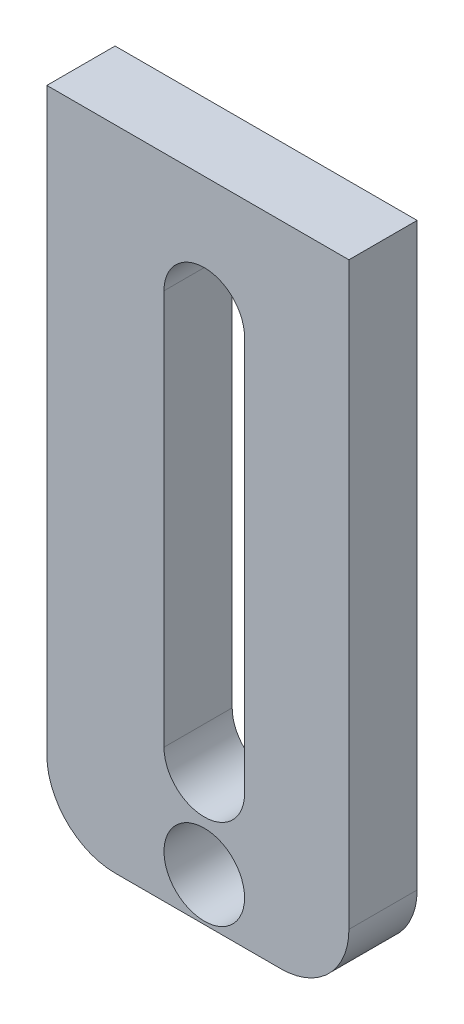
ISO-10303-21;
HEADER;
FILE_DESCRIPTION(('STEP AP214'),'2;1');
FILE_NAME('part.step','',(''),(''),'','','');
FILE_SCHEMA(('AUTOMOTIVE_DESIGN { 1 0 10303 214 1 1 1 1 }'));
ENDSEC;
DATA;
#1=APPLICATION_CONTEXT('core data for automotive mechanical design processes');
#2=APPLICATION_PROTOCOL_DEFINITION('international standard','automotive_design',2000,#1);
#3=PRODUCT_CONTEXT('',#1,'mechanical');
#4=PRODUCT('Part','Part','',(#3));
#5=PRODUCT_RELATED_PRODUCT_CATEGORY('part','',(#4));
#6=PRODUCT_DEFINITION_FORMATION('','',#4);
#7=PRODUCT_DEFINITION_CONTEXT('part definition',#1,'design');
#8=PRODUCT_DEFINITION('design','',#6,#7);
#9=PRODUCT_DEFINITION_SHAPE('','',#8);
#10=(LENGTH_UNIT() NAMED_UNIT(*) SI_UNIT(.MILLI.,.METRE.));
#11=(NAMED_UNIT(*) PLANE_ANGLE_UNIT() SI_UNIT($,.RADIAN.));
#12=(NAMED_UNIT(*) SI_UNIT($,.STERADIAN.) SOLID_ANGLE_UNIT());
#13=UNCERTAINTY_MEASURE_WITH_UNIT(LENGTH_MEASURE(1.E-05),#10,'distance_accuracy_value','');
#14=(GEOMETRIC_REPRESENTATION_CONTEXT(3) GLOBAL_UNCERTAINTY_ASSIGNED_CONTEXT((#13)) GLOBAL_UNIT_ASSIGNED_CONTEXT((#10,
#11,#12)) REPRESENTATION_CONTEXT('',''));
#15=CARTESIAN_POINT('',(0.,0.,0.));
#16=DIRECTION('',(0.,0.,1.));
#17=DIRECTION('',(1.,0.,0.));
#18=AXIS2_PLACEMENT_3D('',#15,#16,#17);
#19=CARTESIAN_POINT('',(-143.509134839057,40.8788345090407,5.08));
#20=DIRECTION('',(0.,0.,-1.));
#21=DIRECTION('',(-1.,0.,0.));
#22=AXIS2_PLACEMENT_3D('',#19,#20,#21);
#23=CYLINDRICAL_SURFACE('',#22,3.);
#24=CARTESIAN_POINT('',(-143.509134839057,40.8788345090407,0.));
#25=DIRECTION('',(0.,0.,1.));
#26=DIRECTION('',(1.,0.,0.));
#27=AXIS2_PLACEMENT_3D('',#24,#25,#26);
#28=CIRCLE('',#27,3.);
#29=CARTESIAN_POINT('',(-146.509134839057,40.8788345090407,0.));
#30=VERTEX_POINT('',#29);
#31=CARTESIAN_POINT('',(-140.509134839057,40.8788345090407,0.));
#32=VERTEX_POINT('',#31);
#33=EDGE_CURVE('E165',#30,#32,#28,.T.);
#34=ORIENTED_EDGE('',*,*,#33,.F.);
#35=DIRECTION('',(0.,0.,-1.));
#36=VECTOR('',#35,1.);
#37=CARTESIAN_POINT('',(-146.509134839057,40.8788345090407,5.08));
#38=LINE('',#37,#36);
#39=CARTESIAN_POINT('',(-146.509134839057,40.8788345090407,5.08));
#40=VERTEX_POINT('',#39);
#41=EDGE_CURVE('E11',#40,#30,#38,.T.);
#42=ORIENTED_EDGE('',*,*,#41,.F.);
#43=CARTESIAN_POINT('',(-143.509134839057,40.8788345090407,5.08));
#44=DIRECTION('',(0.,0.,1.));
#45=DIRECTION('',(1.,0.,0.));
#46=AXIS2_PLACEMENT_3D('',#43,#44,#45);
#47=CIRCLE('',#46,3.);
#48=CARTESIAN_POINT('',(-140.509134839057,40.8788345090407,5.08));
#49=VERTEX_POINT('',#48);
#50=EDGE_CURVE('E136',#40,#49,#47,.T.);
#51=ORIENTED_EDGE('',*,*,#50,.T.);
#52=DIRECTION('',(0.,0.,-1.));
#53=VECTOR('',#52,1.);
#54=CARTESIAN_POINT('',(-140.509134839057,40.8788345090407,5.08));
#55=LINE('',#54,#53);
#56=EDGE_CURVE('E94',#49,#32,#55,.T.);
#57=ORIENTED_EDGE('',*,*,#56,.T.);
#58=EDGE_LOOP('',(#34,#42,#51,#57));
#59=FACE_BOUND('',#58,.T.);
#60=ADVANCED_FACE('F35',(#59),#23,.F.);
#61=CARTESIAN_POINT('',(-146.509134839057,0.,5.08));
#62=DIRECTION('',(1.,0.,0.));
#63=DIRECTION('',(0.,0.,-1.));
#64=AXIS2_PLACEMENT_3D('',#61,#62,#63);
#65=PLANE('',#64);
#66=DIRECTION('',(0.,-1.,0.));
#67=VECTOR('',#66,1.);
#68=CARTESIAN_POINT('',(-146.509134839057,0.,0.));
#69=LINE('',#68,#67);
#70=CARTESIAN_POINT('',(-146.509134839057,70.311824491359,0.));
#71=VERTEX_POINT('',#70);
#72=EDGE_CURVE('E127',#71,#30,#69,.T.);
#73=ORIENTED_EDGE('',*,*,#72,.F.);
#74=DIRECTION('',(0.,0.,-1.));
#75=VECTOR('',#74,1.);
#76=CARTESIAN_POINT('',(-146.509134839057,70.311824491359,5.08));
#77=LINE('',#76,#75);
#78=CARTESIAN_POINT('',(-146.509134839057,70.311824491359,5.08));
#79=VERTEX_POINT('',#78);
#80=EDGE_CURVE('E45',#79,#71,#77,.T.);
#81=ORIENTED_EDGE('',*,*,#80,.F.);
#82=DIRECTION('',(0.,-1.,0.));
#83=VECTOR('',#82,1.);
#84=CARTESIAN_POINT('',(-146.509134839057,0.,5.08));
#85=LINE('',#84,#83);
#86=EDGE_CURVE('E125',#79,#40,#85,.T.);
#87=ORIENTED_EDGE('',*,*,#86,.T.);
#88=ORIENTED_EDGE('',*,*,#41,.T.);
#89=EDGE_LOOP('',(#73,#81,#87,#88));
#90=FACE_BOUND('',#89,.T.);
#91=ADVANCED_FACE('F124',(#90),#65,.T.);
#92=CARTESIAN_POINT('',(-143.509134839057,70.311824491359,5.08));
#93=DIRECTION('',(0.,0.,-1.));
#94=DIRECTION('',(-1.,0.,0.));
#95=AXIS2_PLACEMENT_3D('',#92,#93,#94);
#96=CYLINDRICAL_SURFACE('',#95,3.);
#97=CARTESIAN_POINT('',(-143.509134839057,70.311824491359,0.));
#98=DIRECTION('',(0.,0.,1.));
#99=DIRECTION('',(1.,0.,0.));
#100=AXIS2_PLACEMENT_3D('',#97,#98,#99);
#101=CIRCLE('',#100,3.);
#102=CARTESIAN_POINT('',(-140.509134839057,70.311824491359,0.));
#103=VERTEX_POINT('',#102);
#104=EDGE_CURVE('E169',#103,#71,#101,.T.);
#105=ORIENTED_EDGE('',*,*,#104,.F.);
#106=DIRECTION('',(0.,0.,-1.));
#107=VECTOR('',#106,1.);
#108=CARTESIAN_POINT('',(-140.509134839057,70.311824491359,5.08));
#109=LINE('',#108,#107);
#110=CARTESIAN_POINT('',(-140.509134839057,70.311824491359,5.08));
#111=VERTEX_POINT('',#110);
#112=EDGE_CURVE('E87',#111,#103,#109,.T.);
#113=ORIENTED_EDGE('',*,*,#112,.F.);
#114=CARTESIAN_POINT('',(-143.509134839057,70.311824491359,5.08));
#115=DIRECTION('',(0.,0.,1.));
#116=DIRECTION('',(1.,0.,0.));
#117=AXIS2_PLACEMENT_3D('',#114,#115,#116);
#118=CIRCLE('',#117,3.);
#119=EDGE_CURVE('E135',#111,#79,#118,.T.);
#120=ORIENTED_EDGE('',*,*,#119,.T.);
#121=ORIENTED_EDGE('',*,*,#80,.T.);
#122=EDGE_LOOP('',(#105,#113,#120,#121));
#123=FACE_BOUND('',#122,.T.);
#124=ADVANCED_FACE('F138',(#123),#96,.F.);
#125=CARTESIAN_POINT('',(-150.150857377842,36.0192520602848,5.08));
#126=DIRECTION('',(0.,0.,-1.));
#127=DIRECTION('',(-1.,0.,0.));
#128=AXIS2_PLACEMENT_3D('',#125,#126,#127);
#129=CYLINDRICAL_SURFACE('',#128,5.08);
#130=CARTESIAN_POINT('',(-150.150857377842,36.0192520602848,0.));
#131=DIRECTION('',(0.,0.,1.));
#132=DIRECTION('',(1.,0.,0.));
#133=AXIS2_PLACEMENT_3D('',#130,#131,#132);
#134=CIRCLE('',#133,5.08);
#135=CARTESIAN_POINT('',(-150.150857377842,30.9392520602848,0.));
#136=VERTEX_POINT('',#135);
#137=CARTESIAN_POINT('',(-155.230857377842,36.0192520602848,0.));
#138=VERTEX_POINT('',#137);
#139=EDGE_CURVE('E147',#136,#138,#134,.F.);
#140=ORIENTED_EDGE('',*,*,#139,.F.);
#141=DIRECTION('',(0.,0.,-1.));
#142=VECTOR('',#141,1.);
#143=CARTESIAN_POINT('',(-150.150857377842,30.9392520602848,5.08));
#144=LINE('',#143,#142);
#145=CARTESIAN_POINT('',(-150.150857377842,30.9392520602848,5.08));
#146=VERTEX_POINT('',#145);
#147=EDGE_CURVE('E39',#146,#136,#144,.T.);
#148=ORIENTED_EDGE('',*,*,#147,.F.);
#149=CARTESIAN_POINT('',(-150.150857377842,36.0192520602848,5.08));
#150=DIRECTION('',(0.,0.,1.));
#151=DIRECTION('',(1.,0.,0.));
#152=AXIS2_PLACEMENT_3D('',#149,#150,#151);
#153=CIRCLE('',#152,5.08);
#154=CARTESIAN_POINT('',(-155.230857377842,36.0192520602848,5.08));
#155=VERTEX_POINT('',#154);
#156=EDGE_CURVE('E176',#146,#155,#153,.F.);
#157=ORIENTED_EDGE('',*,*,#156,.T.);
#158=DIRECTION('',(0.,0.,-1.));
#159=VECTOR('',#158,1.);
#160=CARTESIAN_POINT('',(-155.230857377842,36.0192520602848,5.08));
#161=LINE('',#160,#159);
#162=EDGE_CURVE('E146',#155,#138,#161,.T.);
#163=ORIENTED_EDGE('',*,*,#162,.T.);
#164=EDGE_LOOP('',(#140,#148,#157,#163));
#165=FACE_BOUND('',#164,.T.);
#166=ADVANCED_FACE('F37',(#165),#129,.T.);
#167=CARTESIAN_POINT('',(0.,30.9392520602848,5.08));
#168=DIRECTION('',(0.,-1.,0.));
#169=DIRECTION('',(0.,0.,-1.));
#170=AXIS2_PLACEMENT_3D('',#167,#168,#169);
#171=PLANE('',#170);
#172=DIRECTION('',(-1.,0.,0.));
#173=VECTOR('',#172,1.);
#174=CARTESIAN_POINT('',(0.,30.9392520602848,0.));
#175=LINE('',#174,#173);
#176=CARTESIAN_POINT('',(-137.817233388771,30.9392520602848,0.));
#177=VERTEX_POINT('',#176);
#178=EDGE_CURVE('E150',#177,#136,#175,.T.);
#179=ORIENTED_EDGE('',*,*,#178,.F.);
#180=DIRECTION('',(0.,0.,-1.));
#181=VECTOR('',#180,1.);
#182=CARTESIAN_POINT('',(-137.817233388771,30.9392520602848,5.08));
#183=LINE('',#182,#181);
#184=CARTESIAN_POINT('',(-137.817233388771,30.9392520602848,5.08));
#185=VERTEX_POINT('',#184);
#186=EDGE_CURVE('E185',#185,#177,#183,.T.);
#187=ORIENTED_EDGE('',*,*,#186,.F.);
#188=DIRECTION('',(-1.,0.,0.));
#189=VECTOR('',#188,1.);
#190=CARTESIAN_POINT('',(0.,30.9392520602848,5.08));
#191=LINE('',#190,#189);
#192=EDGE_CURVE('E194',#185,#146,#191,.T.);
#193=ORIENTED_EDGE('',*,*,#192,.T.);
#194=ORIENTED_EDGE('',*,*,#147,.T.);
#195=EDGE_LOOP('',(#179,#187,#193,#194));
#196=FACE_BOUND('',#195,.T.);
#197=ADVANCED_FACE('F192',(#196),#171,.T.);
#198=CARTESIAN_POINT('',(-137.817233388771,36.0192520602848,5.08));
#199=DIRECTION('',(0.,0.,-1.));
#200=DIRECTION('',(-1.,0.,0.));
#201=AXIS2_PLACEMENT_3D('',#198,#199,#200);
#202=CYLINDRICAL_SURFACE('',#201,5.08);
#203=CARTESIAN_POINT('',(-137.817233388771,36.0192520602848,0.));
#204=DIRECTION('',(0.,0.,1.));
#205=DIRECTION('',(1.,0.,0.));
#206=AXIS2_PLACEMENT_3D('',#203,#204,#205);
#207=CIRCLE('',#206,5.08);
#208=CARTESIAN_POINT('',(-132.737233388771,36.0192520602848,0.));
#209=VERTEX_POINT('',#208);
#210=EDGE_CURVE('E153',#209,#177,#207,.F.);
#211=ORIENTED_EDGE('',*,*,#210,.F.);
#212=DIRECTION('',(0.,0.,-1.));
#213=VECTOR('',#212,1.);
#214=CARTESIAN_POINT('',(-132.737233388771,36.0192520602848,5.08));
#215=LINE('',#214,#213);
#216=CARTESIAN_POINT('',(-132.737233388771,36.0192520602848,5.08));
#217=VERTEX_POINT('',#216);
#218=EDGE_CURVE('E184',#217,#209,#215,.T.);
#219=ORIENTED_EDGE('',*,*,#218,.F.);
#220=CARTESIAN_POINT('',(-137.817233388771,36.0192520602848,5.08));
#221=DIRECTION('',(0.,0.,1.));
#222=DIRECTION('',(1.,0.,0.));
#223=AXIS2_PLACEMENT_3D('',#220,#221,#222);
#224=CIRCLE('',#223,5.08);
#225=EDGE_CURVE('E202',#217,#185,#224,.F.);
#226=ORIENTED_EDGE('',*,*,#225,.T.);
#227=ORIENTED_EDGE('',*,*,#186,.T.);
#228=EDGE_LOOP('',(#211,#219,#226,#227));
#229=FACE_BOUND('',#228,.T.);
#230=ADVANCED_FACE('F200',(#229),#202,.T.);
#231=CARTESIAN_POINT('',(-132.737233388771,0.,5.08));
#232=DIRECTION('',(1.,0.,0.));
#233=DIRECTION('',(0.,0.,-1.));
#234=AXIS2_PLACEMENT_3D('',#231,#232,#233);
#235=PLANE('',#234);
#236=DIRECTION('',(0.,-1.,0.));
#237=VECTOR('',#236,1.);
#238=CARTESIAN_POINT('',(-132.737233388771,0.,0.));
#239=LINE('',#238,#237);
#240=CARTESIAN_POINT('',(-132.737233388771,79.1992520602848,0.));
#241=VERTEX_POINT('',#240);
#242=EDGE_CURVE('E156',#241,#209,#239,.T.);
#243=ORIENTED_EDGE('',*,*,#242,.F.);
#244=DIRECTION('',(0.,0.,-1.));
#245=VECTOR('',#244,1.);
#246=CARTESIAN_POINT('',(-132.737233388771,79.1992520602848,5.08));
#247=LINE('',#246,#245);
#248=CARTESIAN_POINT('',(-132.737233388771,79.1992520602848,5.08));
#249=VERTEX_POINT('',#248);
#250=EDGE_CURVE('E182',#249,#241,#247,.T.);
#251=ORIENTED_EDGE('',*,*,#250,.F.);
#252=DIRECTION('',(0.,-1.,0.));
#253=VECTOR('',#252,1.);
#254=CARTESIAN_POINT('',(-132.737233388771,0.,5.08));
#255=LINE('',#254,#253);
#256=EDGE_CURVE('E208',#249,#217,#255,.T.);
#257=ORIENTED_EDGE('',*,*,#256,.T.);
#258=ORIENTED_EDGE('',*,*,#218,.T.);
#259=EDGE_LOOP('',(#243,#251,#257,#258));
#260=FACE_BOUND('',#259,.T.);
#261=ADVANCED_FACE('F211',(#260),#235,.T.);
#262=CARTESIAN_POINT('',(0.,79.1992520602848,5.08));
#263=DIRECTION('',(0.,1.,0.));
#264=DIRECTION('',(0.,0.,1.));
#265=AXIS2_PLACEMENT_3D('',#262,#263,#264);
#266=PLANE('',#265);
#267=DIRECTION('',(1.,0.,0.));
#268=VECTOR('',#267,1.);
#269=CARTESIAN_POINT('',(0.,79.1992520602848,0.));
#270=LINE('',#269,#268);
#271=CARTESIAN_POINT('',(-155.230857377842,79.1992520602848,0.));
#272=VERTEX_POINT('',#271);
#273=EDGE_CURVE('E159',#272,#241,#270,.T.);
#274=ORIENTED_EDGE('',*,*,#273,.F.);
#275=DIRECTION('',(0.,0.,-1.));
#276=VECTOR('',#275,1.);
#277=CARTESIAN_POINT('',(-155.230857377842,79.1992520602848,5.08));
#278=LINE('',#277,#276);
#279=CARTESIAN_POINT('',(-155.230857377842,79.1992520602848,5.08));
#280=VERTEX_POINT('',#279);
#281=EDGE_CURVE('E180',#280,#272,#278,.T.);
#282=ORIENTED_EDGE('',*,*,#281,.F.);
#283=DIRECTION('',(1.,0.,0.));
#284=VECTOR('',#283,1.);
#285=CARTESIAN_POINT('',(0.,79.1992520602848,5.08));
#286=LINE('',#285,#284);
#287=EDGE_CURVE('E212',#280,#249,#286,.T.);
#288=ORIENTED_EDGE('',*,*,#287,.T.);
#289=ORIENTED_EDGE('',*,*,#250,.T.);
#290=EDGE_LOOP('',(#274,#282,#288,#289));
#291=FACE_BOUND('',#290,.T.);
#292=ADVANCED_FACE('F223',(#291),#266,.T.);
#293=CARTESIAN_POINT('',(-140.509134839057,0.,5.08));
#294=DIRECTION('',(1.,0.,0.));
#295=DIRECTION('',(0.,0.,-1.));
#296=AXIS2_PLACEMENT_3D('',#293,#294,#295);
#297=PLANE('',#296);
#298=DIRECTION('',(0.,-1.,0.));
#299=VECTOR('',#298,1.);
#300=CARTESIAN_POINT('',(-140.509134839057,0.,0.));
#301=LINE('',#300,#299);
#302=EDGE_CURVE('E171',#103,#32,#301,.T.);
#303=ORIENTED_EDGE('',*,*,#302,.T.);
#304=ORIENTED_EDGE('',*,*,#56,.F.);
#305=DIRECTION('',(0.,-1.,0.));
#306=VECTOR('',#305,1.);
#307=CARTESIAN_POINT('',(-140.509134839057,0.,5.08));
#308=LINE('',#307,#306);
#309=EDGE_CURVE('E54',#111,#49,#308,.T.);
#310=ORIENTED_EDGE('',*,*,#309,.F.);
#311=ORIENTED_EDGE('',*,*,#112,.T.);
#312=EDGE_LOOP('',(#303,#304,#310,#311));
#313=FACE_BOUND('',#312,.T.);
#314=ADVANCED_FACE('F220',(#313),#297,.F.);
#315=CARTESIAN_POINT('',(-155.230857377842,0.,5.08));
#316=DIRECTION('',(-1.,0.,0.));
#317=DIRECTION('',(0.,0.,1.));
#318=AXIS2_PLACEMENT_3D('',#315,#316,#317);
#319=PLANE('',#318);
#320=DIRECTION('',(0.,1.,0.));
#321=VECTOR('',#320,1.);
#322=CARTESIAN_POINT('',(-155.230857377842,0.,0.));
#323=LINE('',#322,#321);
#324=EDGE_CURVE('E162',#138,#272,#323,.T.);
#325=ORIENTED_EDGE('',*,*,#324,.F.);
#326=ORIENTED_EDGE('',*,*,#162,.F.);
#327=DIRECTION('',(0.,1.,0.));
#328=VECTOR('',#327,1.);
#329=CARTESIAN_POINT('',(-155.230857377842,0.,5.08));
#330=LINE('',#329,#328);
#331=EDGE_CURVE('E214',#155,#280,#330,.T.);
#332=ORIENTED_EDGE('',*,*,#331,.T.);
#333=ORIENTED_EDGE('',*,*,#281,.T.);
#334=EDGE_LOOP('',(#325,#326,#332,#333));
#335=FACE_BOUND('',#334,.T.);
#336=ADVANCED_FACE('F222',(#335),#319,.T.);
#337=CARTESIAN_POINT('',(-143.509134839057,34.1617201720865,5.08));
#338=DIRECTION('',(0.,0.,-1.));
#339=DIRECTION('',(-1.,0.,0.));
#340=AXIS2_PLACEMENT_3D('',#337,#338,#339);
#341=CYLINDRICAL_SURFACE('',#340,2.99999999999999);
#342=CARTESIAN_POINT('',(-143.509134839057,34.1617201720865,5.08));
#343=DIRECTION('',(0.,0.,1.));
#344=DIRECTION('',(1.,0.,0.));
#345=AXIS2_PLACEMENT_3D('',#342,#343,#344);
#346=CIRCLE('',#345,2.99999999999999);
#347=CARTESIAN_POINT('',(-140.509134839057,34.1617201720865,5.08));
#348=VERTEX_POINT('',#347);
#349=EDGE_CURVE('E140',#348,#348,#346,.T.);
#350=ORIENTED_EDGE('',*,*,#349,.T.);
#351=EDGE_LOOP('',(#350));
#352=FACE_BOUND('',#351,.T.);
#353=CARTESIAN_POINT('',(-143.509134839057,34.1617201720865,0.));
#354=DIRECTION('',(0.,0.,1.));
#355=DIRECTION('',(1.,0.,0.));
#356=AXIS2_PLACEMENT_3D('',#353,#354,#355);
#357=CIRCLE('',#356,2.99999999999999);
#358=CARTESIAN_POINT('',(-140.509134839057,34.1617201720865,0.));
#359=VERTEX_POINT('',#358);
#360=EDGE_CURVE('E173',#359,#359,#357,.T.);
#361=ORIENTED_EDGE('',*,*,#360,.F.);
#362=EDGE_LOOP('',(#361));
#363=FACE_BOUND('',#362,.T.);
#364=ADVANCED_FACE('F229',(#352,#363),#341,.F.);
#365=CARTESIAN_POINT('',(0.,0.,5.08));
#366=DIRECTION('',(0.,0.,1.));
#367=DIRECTION('',(1.,0.,0.));
#368=AXIS2_PLACEMENT_3D('',#365,#366,#367);
#369=PLANE('',#368);
#370=ORIENTED_EDGE('',*,*,#156,.F.);
#371=ORIENTED_EDGE('',*,*,#192,.F.);
#372=ORIENTED_EDGE('',*,*,#225,.F.);
#373=ORIENTED_EDGE('',*,*,#256,.F.);
#374=ORIENTED_EDGE('',*,*,#287,.F.);
#375=ORIENTED_EDGE('',*,*,#331,.F.);
#376=EDGE_LOOP('',(#370,#371,#372,#373,#374,#375));
#377=FACE_BOUND('',#376,.T.);
#378=ORIENTED_EDGE('',*,*,#50,.F.);
#379=ORIENTED_EDGE('',*,*,#86,.F.);
#380=ORIENTED_EDGE('',*,*,#119,.F.);
#381=ORIENTED_EDGE('',*,*,#309,.T.);
#382=EDGE_LOOP('',(#378,#379,#380,#381));
#383=FACE_BOUND('',#382,.T.);
#384=ORIENTED_EDGE('',*,*,#349,.F.);
#385=EDGE_LOOP('',(#384));
#386=FACE_BOUND('',#385,.T.);
#387=ADVANCED_FACE('F133',(#377,#383,#386),#369,.T.);
#388=CARTESIAN_POINT('',(0.,0.,0.));
#389=DIRECTION('',(0.,0.,1.));
#390=DIRECTION('',(1.,0.,0.));
#391=AXIS2_PLACEMENT_3D('',#388,#389,#390);
#392=PLANE('',#391);
#393=ORIENTED_EDGE('',*,*,#139,.T.);
#394=ORIENTED_EDGE('',*,*,#324,.T.);
#395=ORIENTED_EDGE('',*,*,#273,.T.);
#396=ORIENTED_EDGE('',*,*,#242,.T.);
#397=ORIENTED_EDGE('',*,*,#210,.T.);
#398=ORIENTED_EDGE('',*,*,#178,.T.);
#399=EDGE_LOOP('',(#393,#394,#395,#396,#397,#398));
#400=FACE_BOUND('',#399,.T.);
#401=ORIENTED_EDGE('',*,*,#33,.T.);
#402=ORIENTED_EDGE('',*,*,#302,.F.);
#403=ORIENTED_EDGE('',*,*,#104,.T.);
#404=ORIENTED_EDGE('',*,*,#72,.T.);
#405=EDGE_LOOP('',(#401,#402,#403,#404));
#406=FACE_BOUND('',#405,.T.);
#407=ORIENTED_EDGE('',*,*,#360,.T.);
#408=EDGE_LOOP('',(#407));
#409=FACE_BOUND('',#408,.T.);
#410=ADVANCED_FACE('F197',(#400,#406,#409),#392,.F.);
#411=CLOSED_SHELL('',(#60,#91,#124,#166,#197,#230,#261,#292,#314,#336,#364,#387,#410));
#412=MANIFOLD_SOLID_BREP('B2',#411);
#413=ADVANCED_BREP_SHAPE_REPRESENTATION('',(#18,#412),#14);
#414=SHAPE_DEFINITION_REPRESENTATION(#9,#413);
ENDSEC;
END-ISO-10303-21;
